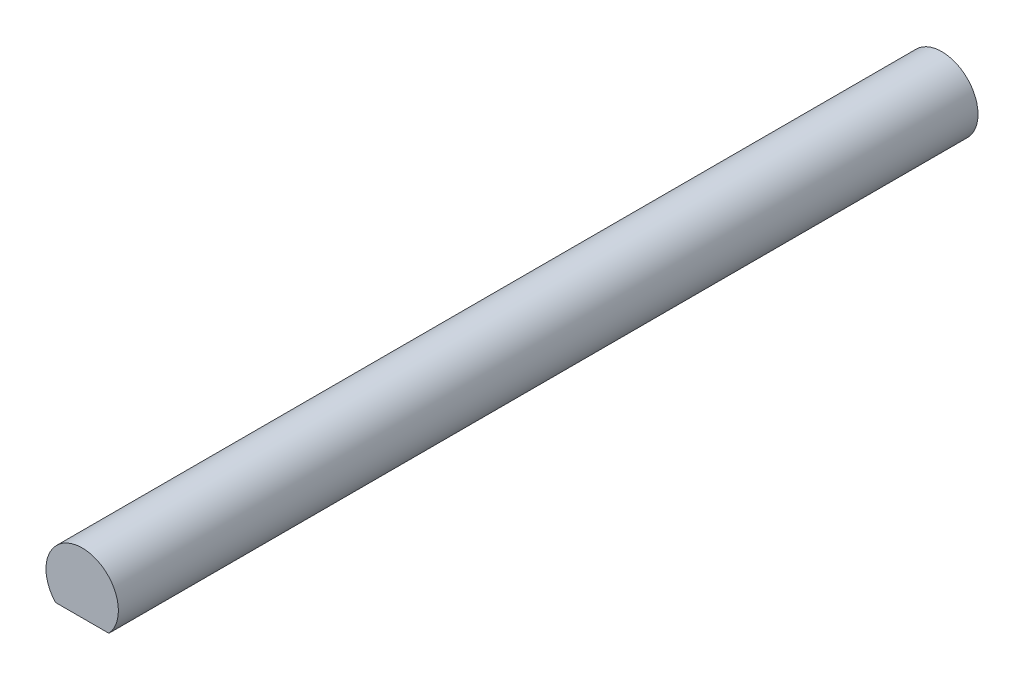
ISO-10303-21;
HEADER;
FILE_DESCRIPTION(('STEP AP214'),'2;1');
FILE_NAME('part.step','',(''),(''),'','','');
FILE_SCHEMA(('AUTOMOTIVE_DESIGN { 1 0 10303 214 1 1 1 1 }'));
ENDSEC;
DATA;
#1=APPLICATION_CONTEXT('core data for automotive mechanical design processes');
#2=APPLICATION_PROTOCOL_DEFINITION('international standard','automotive_design',2000,#1);
#3=PRODUCT_CONTEXT('',#1,'mechanical');
#4=PRODUCT('Part','Part','',(#3));
#5=PRODUCT_RELATED_PRODUCT_CATEGORY('part','',(#4));
#6=PRODUCT_DEFINITION_FORMATION('','',#4);
#7=PRODUCT_DEFINITION_CONTEXT('part definition',#1,'design');
#8=PRODUCT_DEFINITION('design','',#6,#7);
#9=PRODUCT_DEFINITION_SHAPE('','',#8);
#10=(LENGTH_UNIT() NAMED_UNIT(*) SI_UNIT(.MILLI.,.METRE.));
#11=(NAMED_UNIT(*) PLANE_ANGLE_UNIT() SI_UNIT($,.RADIAN.));
#12=(NAMED_UNIT(*) SI_UNIT($,.STERADIAN.) SOLID_ANGLE_UNIT());
#13=UNCERTAINTY_MEASURE_WITH_UNIT(LENGTH_MEASURE(1.E-05),#10,'distance_accuracy_value','');
#14=(GEOMETRIC_REPRESENTATION_CONTEXT(3) GLOBAL_UNCERTAINTY_ASSIGNED_CONTEXT((#13)) GLOBAL_UNIT_ASSIGNED_CONTEXT((#10,
#11,#12)) REPRESENTATION_CONTEXT('',''));
#15=CARTESIAN_POINT('',(0.,0.,0.));
#16=DIRECTION('',(0.,0.,1.));
#17=DIRECTION('',(1.,0.,0.));
#18=AXIS2_PLACEMENT_3D('',#15,#16,#17);
#19=CARTESIAN_POINT('',(0.,0.,47.5));
#20=DIRECTION('',(0.,0.,-1.));
#21=DIRECTION('',(-1.,0.,0.));
#22=AXIS2_PLACEMENT_3D('',#19,#20,#21);
#23=CYLINDRICAL_SURFACE('',#22,4.);
#24=CARTESIAN_POINT('',(0.,0.,-47.5));
#25=DIRECTION('',(0.,0.,1.));
#26=DIRECTION('',(1.,0.,0.));
#27=AXIS2_PLACEMENT_3D('',#24,#25,#26);
#28=CIRCLE('',#27,4.);
#29=CARTESIAN_POINT('',(2.95127091267474,-2.7,-47.5));
#30=VERTEX_POINT('',#29);
#31=CARTESIAN_POINT('',(-2.95127091267474,-2.7,-47.5));
#32=VERTEX_POINT('',#31);
#33=EDGE_CURVE('E75',#30,#32,#28,.T.);
#34=ORIENTED_EDGE('',*,*,#33,.T.);
#35=DIRECTION('',(0.,0.,-1.));
#36=VECTOR('',#35,1.);
#37=CARTESIAN_POINT('',(-2.95127091267474,-2.7,47.5));
#38=LINE('',#37,#36);
#39=CARTESIAN_POINT('',(-2.95127091267474,-2.7,47.5));
#40=VERTEX_POINT('',#39);
#41=EDGE_CURVE('E11',#40,#32,#38,.T.);
#42=ORIENTED_EDGE('',*,*,#41,.F.);
#43=CARTESIAN_POINT('',(0.,0.,47.5));
#44=DIRECTION('',(0.,0.,1.));
#45=DIRECTION('',(1.,0.,0.));
#46=AXIS2_PLACEMENT_3D('',#43,#44,#45);
#47=CIRCLE('',#46,4.);
#48=CARTESIAN_POINT('',(2.95127091267474,-2.7,47.5));
#49=VERTEX_POINT('',#48);
#50=EDGE_CURVE('E72',#49,#40,#47,.T.);
#51=ORIENTED_EDGE('',*,*,#50,.F.);
#52=DIRECTION('',(0.,0.,-1.));
#53=VECTOR('',#52,1.);
#54=CARTESIAN_POINT('',(2.95127091267474,-2.7,47.5));
#55=LINE('',#54,#53);
#56=EDGE_CURVE('E47',#49,#30,#55,.T.);
#57=ORIENTED_EDGE('',*,*,#56,.T.);
#58=EDGE_LOOP('',(#34,#42,#51,#57));
#59=FACE_BOUND('',#58,.T.);
#60=ADVANCED_FACE('F41',(#59),#23,.T.);
#61=CARTESIAN_POINT('',(-2.95127091267474,-2.7,47.5));
#62=DIRECTION('',(0.,1.,0.));
#63=DIRECTION('',(0.,0.,1.));
#64=AXIS2_PLACEMENT_3D('',#61,#62,#63);
#65=PLANE('',#64);
#66=DIRECTION('',(1.,0.,0.));
#67=VECTOR('',#66,1.);
#68=CARTESIAN_POINT('',(-2.95127091267474,-2.7,-47.5));
#69=LINE('',#68,#67);
#70=EDGE_CURVE('E63',#32,#30,#69,.T.);
#71=ORIENTED_EDGE('',*,*,#70,.T.);
#72=ORIENTED_EDGE('',*,*,#56,.F.);
#73=DIRECTION('',(1.,0.,0.));
#74=VECTOR('',#73,1.);
#75=CARTESIAN_POINT('',(-2.95127091267474,-2.7,47.5));
#76=LINE('',#75,#74);
#77=EDGE_CURVE('E57',#40,#49,#76,.T.);
#78=ORIENTED_EDGE('',*,*,#77,.F.);
#79=ORIENTED_EDGE('',*,*,#41,.T.);
#80=EDGE_LOOP('',(#71,#72,#78,#79));
#81=FACE_BOUND('',#80,.T.);
#82=ADVANCED_FACE('F70',(#81),#65,.F.);
#83=CARTESIAN_POINT('',(0.,0.,47.5));
#84=DIRECTION('',(0.,0.,1.));
#85=DIRECTION('',(1.,0.,0.));
#86=AXIS2_PLACEMENT_3D('',#83,#84,#85);
#87=PLANE('',#86);
#88=ORIENTED_EDGE('',*,*,#50,.T.);
#89=ORIENTED_EDGE('',*,*,#77,.T.);
#90=EDGE_LOOP('',(#88,#89));
#91=FACE_BOUND('',#90,.T.);
#92=ADVANCED_FACE('F78',(#91),#87,.T.);
#93=CARTESIAN_POINT('',(0.,0.,-47.5));
#94=DIRECTION('',(0.,0.,1.));
#95=DIRECTION('',(1.,0.,0.));
#96=AXIS2_PLACEMENT_3D('',#93,#94,#95);
#97=PLANE('',#96);
#98=ORIENTED_EDGE('',*,*,#33,.F.);
#99=ORIENTED_EDGE('',*,*,#70,.F.);
#100=EDGE_LOOP('',(#98,#99));
#101=FACE_BOUND('',#100,.T.);
#102=ADVANCED_FACE('F73',(#101),#97,.F.);
#103=CLOSED_SHELL('',(#60,#82,#92,#102));
#104=MANIFOLD_SOLID_BREP('B2',#103);
#105=ADVANCED_BREP_SHAPE_REPRESENTATION('',(#18,#104),#14);
#106=SHAPE_DEFINITION_REPRESENTATION(#9,#105);
ENDSEC;
END-ISO-10303-21;
